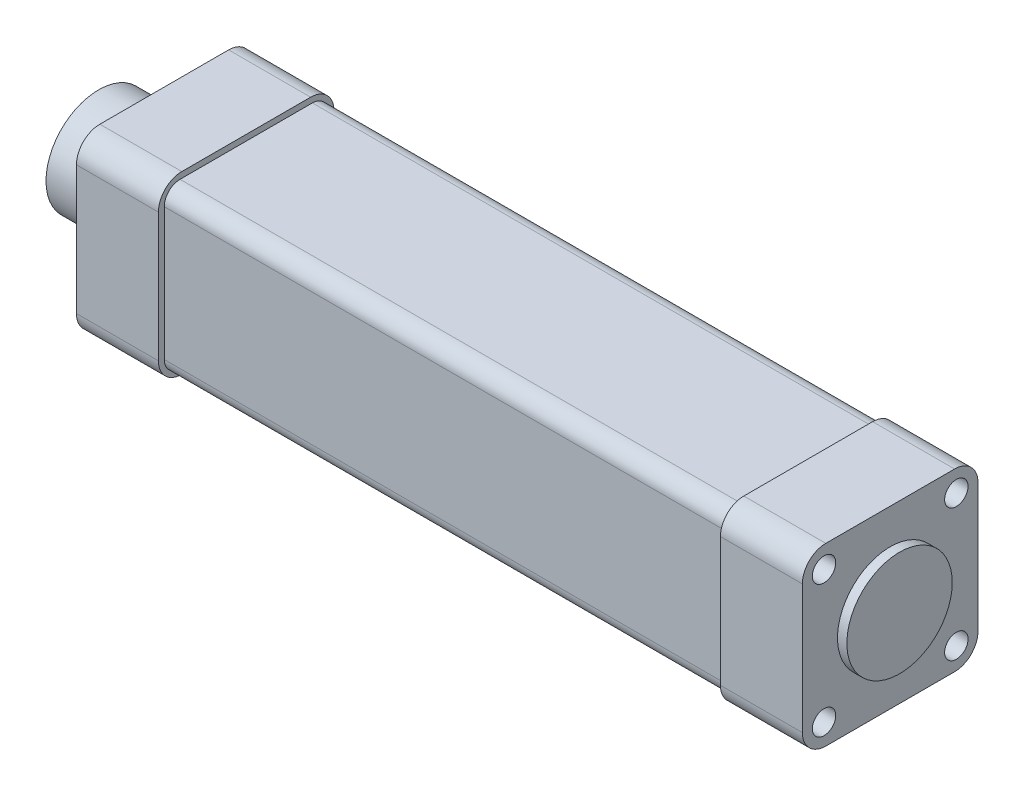
ISO-10303-21;
HEADER;
FILE_DESCRIPTION(('STEP AP214'),'2;1');
FILE_NAME('part.step','',(''),(''),'','','');
FILE_SCHEMA(('AUTOMOTIVE_DESIGN { 1 0 10303 214 1 1 1 1 }'));
ENDSEC;
DATA;
#1=APPLICATION_CONTEXT('core data for automotive mechanical design processes');
#2=APPLICATION_PROTOCOL_DEFINITION('international standard','automotive_design',2000,#1);
#3=PRODUCT_CONTEXT('',#1,'mechanical');
#4=PRODUCT('Part','Part','',(#3));
#5=PRODUCT_RELATED_PRODUCT_CATEGORY('part','',(#4));
#6=PRODUCT_DEFINITION_FORMATION('','',#4);
#7=PRODUCT_DEFINITION_CONTEXT('part definition',#1,'design');
#8=PRODUCT_DEFINITION('design','',#6,#7);
#9=PRODUCT_DEFINITION_SHAPE('','',#8);
#10=(LENGTH_UNIT() NAMED_UNIT(*) SI_UNIT(.MILLI.,.METRE.));
#11=(NAMED_UNIT(*) PLANE_ANGLE_UNIT() SI_UNIT($,.RADIAN.));
#12=(NAMED_UNIT(*) SI_UNIT($,.STERADIAN.) SOLID_ANGLE_UNIT());
#13=UNCERTAINTY_MEASURE_WITH_UNIT(LENGTH_MEASURE(1.E-05),#10,'distance_accuracy_value','');
#14=(GEOMETRIC_REPRESENTATION_CONTEXT(3) GLOBAL_UNCERTAINTY_ASSIGNED_CONTEXT((#13)) GLOBAL_UNIT_ASSIGNED_CONTEXT((#10,
#11,#12)) REPRESENTATION_CONTEXT('',''));
#15=CARTESIAN_POINT('',(0.,0.,0.));
#16=DIRECTION('',(0.,0.,1.));
#17=DIRECTION('',(1.,0.,0.));
#18=AXIS2_PLACEMENT_3D('',#15,#16,#17);
#19=CARTESIAN_POINT('',(0.,27.5,27.5));
#20=DIRECTION('',(-1.,0.,0.));
#21=DIRECTION('',(0.,0.,1.));
#22=AXIS2_PLACEMENT_3D('',#19,#20,#21);
#23=PLANE('',#22);
#24=CARTESIAN_POINT('',(0.,0.,0.));
#25=DIRECTION('',(-1.,0.,0.));
#26=DIRECTION('',(0.,0.,1.));
#27=AXIS2_PLACEMENT_3D('',#24,#25,#26);
#28=CIRCLE('',#27,10.);
#29=CARTESIAN_POINT('',(0.,0.,10.));
#30=VERTEX_POINT('',#29);
#31=EDGE_CURVE('E513',#30,#30,#28,.F.);
#32=ORIENTED_EDGE('',*,*,#31,.F.);
#33=EDGE_LOOP('',(#32));
#34=FACE_BOUND('',#33,.T.);
#35=CARTESIAN_POINT('',(0.,0.,0.));
#36=DIRECTION('',(1.,0.,0.));
#37=DIRECTION('',(0.,0.,-1.));
#38=AXIS2_PLACEMENT_3D('',#35,#36,#37);
#39=CIRCLE('',#38,31.5);
#40=CARTESIAN_POINT('',(0.,0.,-31.5));
#41=VERTEX_POINT('',#40);
#42=EDGE_CURVE('E307',#41,#41,#39,.T.);
#43=ORIENTED_EDGE('',*,*,#42,.T.);
#44=EDGE_LOOP('',(#43));
#45=FACE_BOUND('',#44,.T.);
#46=ADVANCED_FACE('F39',(#34,#45),#23,.F.);
#47=CARTESIAN_POINT('',(240.,-27.5,-27.5));
#48=DIRECTION('',(1.,0.,0.));
#49=DIRECTION('',(0.,0.,-1.));
#50=AXIS2_PLACEMENT_3D('',#47,#48,#49);
#51=PLANE('',#50);
#52=CARTESIAN_POINT('',(240.,0.,0.));
#53=DIRECTION('',(1.,0.,0.));
#54=DIRECTION('',(0.,0.,-1.));
#55=AXIS2_PLACEMENT_3D('',#52,#53,#54);
#56=CIRCLE('',#55,31.5);
#57=CARTESIAN_POINT('',(240.,0.,-31.5));
#58=VERTEX_POINT('',#57);
#59=EDGE_CURVE('E304',#58,#58,#56,.T.);
#60=ORIENTED_EDGE('',*,*,#59,.F.);
#61=EDGE_LOOP('',(#60));
#62=FACE_BOUND('',#61,.T.);
#63=ADVANCED_FACE('F407',(#62),#51,.F.);
#64=CARTESIAN_POINT('',(240.,0.,0.));
#65=DIRECTION('',(-1.,0.,0.));
#66=DIRECTION('',(0.,0.,1.));
#67=AXIS2_PLACEMENT_3D('',#64,#65,#66);
#68=CYLINDRICAL_SURFACE('',#67,31.5);
#69=ORIENTED_EDGE('',*,*,#59,.T.);
#70=EDGE_LOOP('',(#69));
#71=FACE_BOUND('',#70,.T.);
#72=ORIENTED_EDGE('',*,*,#42,.F.);
#73=EDGE_LOOP('',(#72));
#74=FACE_BOUND('',#73,.T.);
#75=ADVANCED_FACE('F413',(#71,#74),#68,.F.);
#76=CARTESIAN_POINT('',(279.001,0.,0.));
#77=DIRECTION('',(-1.,0.,0.));
#78=DIRECTION('',(0.,0.,1.));
#79=AXIS2_PLACEMENT_3D('',#76,#77,#78);
#80=CYLINDRICAL_SURFACE('',#79,10.);
#81=CARTESIAN_POINT('',(-63.,0.,0.));
#82=DIRECTION('',(-1.,0.,0.));
#83=DIRECTION('',(0.,0.,1.));
#84=AXIS2_PLACEMENT_3D('',#81,#82,#83);
#85=CIRCLE('',#84,10.);
#86=CARTESIAN_POINT('',(-63.,0.,10.));
#87=VERTEX_POINT('',#86);
#88=EDGE_CURVE('E510',#87,#87,#85,.T.);
#89=ORIENTED_EDGE('',*,*,#88,.T.);
#90=EDGE_LOOP('',(#89));
#91=FACE_BOUND('',#90,.T.);
#92=ORIENTED_EDGE('',*,*,#31,.T.);
#93=EDGE_LOOP('',(#92));
#94=FACE_BOUND('',#93,.T.);
#95=ADVANCED_FACE('F516',(#91,#94),#80,.F.);
#96=CARTESIAN_POINT('',(-35.,27.5,27.5));
#97=DIRECTION('',(-1.,0.,0.));
#98=DIRECTION('',(0.,0.,1.));
#99=AXIS2_PLACEMENT_3D('',#96,#97,#98);
#100=PLANE('',#99);
#101=CARTESIAN_POINT('',(-35.,-28.25,-28.25));
#102=DIRECTION('',(-1.,0.,0.));
#103=DIRECTION('',(0.,0.,1.));
#104=AXIS2_PLACEMENT_3D('',#101,#102,#103);
#105=CIRCLE('',#104,5.);
#106=CARTESIAN_POINT('',(-35.,-28.25,-23.25));
#107=VERTEX_POINT('',#106);
#108=EDGE_CURVE('E501',#107,#107,#105,.T.);
#109=ORIENTED_EDGE('',*,*,#108,.F.);
#110=EDGE_LOOP('',(#109));
#111=FACE_BOUND('',#110,.T.);
#112=CARTESIAN_POINT('',(-35.,28.25,28.25));
#113=DIRECTION('',(-1.,0.,0.));
#114=DIRECTION('',(0.,0.,1.));
#115=AXIS2_PLACEMENT_3D('',#112,#113,#114);
#116=CIRCLE('',#115,5.);
#117=CARTESIAN_POINT('',(-35.,28.25,33.25));
#118=VERTEX_POINT('',#117);
#119=EDGE_CURVE('E440',#118,#118,#116,.T.);
#120=ORIENTED_EDGE('',*,*,#119,.F.);
#121=EDGE_LOOP('',(#120));
#122=FACE_BOUND('',#121,.T.);
#123=CARTESIAN_POINT('',(-35.,27.5,27.5));
#124=DIRECTION('',(-1.,0.,0.));
#125=DIRECTION('',(0.,0.,1.));
#126=AXIS2_PLACEMENT_3D('',#123,#124,#125);
#127=CIRCLE('',#126,9.99999999999999);
#128=CARTESIAN_POINT('',(-35.,27.5,37.5));
#129=VERTEX_POINT('',#128);
#130=CARTESIAN_POINT('',(-35.,37.5,27.5));
#131=VERTEX_POINT('',#130);
#132=EDGE_CURVE('E208',#129,#131,#127,.T.);
#133=ORIENTED_EDGE('',*,*,#132,.T.);
#134=DIRECTION('',(0.,0.,-1.));
#135=VECTOR('',#134,1.);
#136=CARTESIAN_POINT('',(-35.,37.5,27.5));
#137=LINE('',#136,#135);
#138=CARTESIAN_POINT('',(-35.,37.5,-27.5));
#139=VERTEX_POINT('',#138);
#140=EDGE_CURVE('E197',#131,#139,#137,.T.);
#141=ORIENTED_EDGE('',*,*,#140,.T.);
#142=CARTESIAN_POINT('',(-35.,27.5,-27.5));
#143=DIRECTION('',(-1.,0.,0.));
#144=DIRECTION('',(0.,0.,1.));
#145=AXIS2_PLACEMENT_3D('',#142,#143,#144);
#146=CIRCLE('',#145,9.99999999999999);
#147=CARTESIAN_POINT('',(-35.,27.5,-37.5));
#148=VERTEX_POINT('',#147);
#149=EDGE_CURVE('E207',#139,#148,#146,.T.);
#150=ORIENTED_EDGE('',*,*,#149,.T.);
#151=DIRECTION('',(0.,-1.,0.));
#152=VECTOR('',#151,1.);
#153=CARTESIAN_POINT('',(-35.,-27.5,-37.5));
#154=LINE('',#153,#152);
#155=CARTESIAN_POINT('',(-35.,-27.5,-37.5));
#156=VERTEX_POINT('',#155);
#157=EDGE_CURVE('E475',#148,#156,#154,.T.);
#158=ORIENTED_EDGE('',*,*,#157,.T.);
#159=CARTESIAN_POINT('',(-35.,-27.5,-27.5));
#160=DIRECTION('',(-1.,0.,0.));
#161=DIRECTION('',(0.,0.,-1.));
#162=AXIS2_PLACEMENT_3D('',#159,#160,#161);
#163=CIRCLE('',#162,10.);
#164=CARTESIAN_POINT('',(-35.,-37.5,-27.5));
#165=VERTEX_POINT('',#164);
#166=EDGE_CURVE('E490',#156,#165,#163,.T.);
#167=ORIENTED_EDGE('',*,*,#166,.T.);
#168=DIRECTION('',(0.,0.,1.));
#169=VECTOR('',#168,1.);
#170=CARTESIAN_POINT('',(-35.,-37.5,27.5));
#171=LINE('',#170,#169);
#172=CARTESIAN_POINT('',(-35.,-37.5,27.5));
#173=VERTEX_POINT('',#172);
#174=EDGE_CURVE('E487',#165,#173,#171,.T.);
#175=ORIENTED_EDGE('',*,*,#174,.T.);
#176=CARTESIAN_POINT('',(-35.,-27.5,27.5));
#177=DIRECTION('',(-1.,0.,0.));
#178=DIRECTION('',(0.,0.,1.));
#179=AXIS2_PLACEMENT_3D('',#176,#177,#178);
#180=CIRCLE('',#179,9.99999999999999);
#181=CARTESIAN_POINT('',(-35.,-27.5,37.5));
#182=VERTEX_POINT('',#181);
#183=EDGE_CURVE('E489',#173,#182,#180,.T.);
#184=ORIENTED_EDGE('',*,*,#183,.T.);
#185=DIRECTION('',(0.,1.,0.));
#186=VECTOR('',#185,1.);
#187=CARTESIAN_POINT('',(-35.,-27.5,37.5));
#188=LINE('',#187,#186);
#189=EDGE_CURVE('E214',#182,#129,#188,.T.);
#190=ORIENTED_EDGE('',*,*,#189,.T.);
#191=EDGE_LOOP('',(#133,#141,#150,#158,#167,#175,#184,#190));
#192=FACE_BOUND('',#191,.T.);
#193=CARTESIAN_POINT('',(-35.,28.25,-28.25));
#194=DIRECTION('',(-1.,0.,0.));
#195=DIRECTION('',(0.,0.,1.));
#196=AXIS2_PLACEMENT_3D('',#193,#194,#195);
#197=CIRCLE('',#196,5.);
#198=CARTESIAN_POINT('',(-35.,28.25,-23.25));
#199=VERTEX_POINT('',#198);
#200=EDGE_CURVE('E435',#199,#199,#197,.T.);
#201=ORIENTED_EDGE('',*,*,#200,.F.);
#202=EDGE_LOOP('',(#201));
#203=FACE_BOUND('',#202,.T.);
#204=CARTESIAN_POINT('',(-35.,-28.25,28.25));
#205=DIRECTION('',(-1.,0.,0.));
#206=DIRECTION('',(0.,0.,1.));
#207=AXIS2_PLACEMENT_3D('',#204,#205,#206);
#208=CIRCLE('',#207,5.);
#209=CARTESIAN_POINT('',(-35.,-28.25,33.25));
#210=VERTEX_POINT('',#209);
#211=EDGE_CURVE('E498',#210,#210,#208,.T.);
#212=ORIENTED_EDGE('',*,*,#211,.F.);
#213=EDGE_LOOP('',(#212));
#214=FACE_BOUND('',#213,.T.);
#215=CARTESIAN_POINT('',(-35.,0.,0.));
#216=DIRECTION('',(-1.,0.,0.));
#217=DIRECTION('',(0.,0.,1.));
#218=AXIS2_PLACEMENT_3D('',#215,#216,#217);
#219=CIRCLE('',#218,22.5);
#220=CARTESIAN_POINT('',(-35.,0.,22.5));
#221=VERTEX_POINT('',#220);
#222=EDGE_CURVE('E504',#221,#221,#219,.T.);
#223=ORIENTED_EDGE('',*,*,#222,.F.);
#224=EDGE_LOOP('',(#223));
#225=FACE_BOUND('',#224,.T.);
#226=ADVANCED_FACE('F211',(#111,#122,#192,#203,#214,#225),#100,.T.);
#227=CARTESIAN_POINT('',(275.,-27.5,-27.5));
#228=DIRECTION('',(1.,0.,0.));
#229=DIRECTION('',(0.,0.,-1.));
#230=AXIS2_PLACEMENT_3D('',#227,#228,#229);
#231=PLANE('',#230);
#232=CARTESIAN_POINT('',(275.,-28.25,28.25));
#233=DIRECTION('',(1.,0.,0.));
#234=DIRECTION('',(0.,0.,-1.));
#235=AXIS2_PLACEMENT_3D('',#232,#233,#234);
#236=CIRCLE('',#235,5.);
#237=CARTESIAN_POINT('',(275.,-28.25,23.25));
#238=VERTEX_POINT('',#237);
#239=EDGE_CURVE('E233',#238,#238,#236,.T.);
#240=ORIENTED_EDGE('',*,*,#239,.F.);
#241=EDGE_LOOP('',(#240));
#242=FACE_BOUND('',#241,.T.);
#243=CARTESIAN_POINT('',(275.,28.25,-28.25));
#244=DIRECTION('',(1.,0.,0.));
#245=DIRECTION('',(0.,0.,-1.));
#246=AXIS2_PLACEMENT_3D('',#243,#244,#245);
#247=CIRCLE('',#246,5.);
#248=CARTESIAN_POINT('',(275.,28.25,-33.25));
#249=VERTEX_POINT('',#248);
#250=EDGE_CURVE('E240',#249,#249,#247,.T.);
#251=ORIENTED_EDGE('',*,*,#250,.F.);
#252=EDGE_LOOP('',(#251));
#253=FACE_BOUND('',#252,.T.);
#254=CARTESIAN_POINT('',(275.,-27.5,-27.5));
#255=DIRECTION('',(1.,0.,0.));
#256=DIRECTION('',(0.,0.,-1.));
#257=AXIS2_PLACEMENT_3D('',#254,#255,#256);
#258=CIRCLE('',#257,10.);
#259=CARTESIAN_POINT('',(275.,-37.5,-27.5));
#260=VERTEX_POINT('',#259);
#261=CARTESIAN_POINT('',(275.,-27.5,-37.5));
#262=VERTEX_POINT('',#261);
#263=EDGE_CURVE('E247',#260,#262,#258,.T.);
#264=ORIENTED_EDGE('',*,*,#263,.T.);
#265=DIRECTION('',(0.,1.,0.));
#266=VECTOR('',#265,1.);
#267=CARTESIAN_POINT('',(275.,-27.5,-37.5));
#268=LINE('',#267,#266);
#269=CARTESIAN_POINT('',(275.,27.5,-37.5));
#270=VERTEX_POINT('',#269);
#271=EDGE_CURVE('E250',#262,#270,#268,.T.);
#272=ORIENTED_EDGE('',*,*,#271,.T.);
#273=CARTESIAN_POINT('',(275.,27.5,-27.5));
#274=DIRECTION('',(1.,0.,0.));
#275=DIRECTION('',(0.,0.,1.));
#276=AXIS2_PLACEMENT_3D('',#273,#274,#275);
#277=CIRCLE('',#276,10.);
#278=CARTESIAN_POINT('',(275.,37.5,-27.5));
#279=VERTEX_POINT('',#278);
#280=EDGE_CURVE('E253',#270,#279,#277,.T.);
#281=ORIENTED_EDGE('',*,*,#280,.T.);
#282=DIRECTION('',(0.,0.,1.));
#283=VECTOR('',#282,1.);
#284=CARTESIAN_POINT('',(275.,37.5,27.5));
#285=LINE('',#284,#283);
#286=CARTESIAN_POINT('',(275.,37.5,27.5));
#287=VERTEX_POINT('',#286);
#288=EDGE_CURVE('E255',#279,#287,#285,.T.);
#289=ORIENTED_EDGE('',*,*,#288,.T.);
#290=CARTESIAN_POINT('',(275.,27.5,27.5));
#291=DIRECTION('',(1.,0.,0.));
#292=DIRECTION('',(0.,0.,1.));
#293=AXIS2_PLACEMENT_3D('',#290,#291,#292);
#294=CIRCLE('',#293,10.);
#295=CARTESIAN_POINT('',(275.,27.5,37.5));
#296=VERTEX_POINT('',#295);
#297=EDGE_CURVE('E257',#287,#296,#294,.T.);
#298=ORIENTED_EDGE('',*,*,#297,.T.);
#299=DIRECTION('',(0.,-1.,0.));
#300=VECTOR('',#299,1.);
#301=CARTESIAN_POINT('',(275.,-27.5,37.5));
#302=LINE('',#301,#300);
#303=CARTESIAN_POINT('',(275.,-27.5,37.5));
#304=VERTEX_POINT('',#303);
#305=EDGE_CURVE('E259',#296,#304,#302,.T.);
#306=ORIENTED_EDGE('',*,*,#305,.T.);
#307=CARTESIAN_POINT('',(275.,-27.5,27.5));
#308=DIRECTION('',(1.,0.,0.));
#309=DIRECTION('',(0.,0.,1.));
#310=AXIS2_PLACEMENT_3D('',#307,#308,#309);
#311=CIRCLE('',#310,10.);
#312=CARTESIAN_POINT('',(275.,-37.5,27.5));
#313=VERTEX_POINT('',#312);
#314=EDGE_CURVE('E261',#304,#313,#311,.T.);
#315=ORIENTED_EDGE('',*,*,#314,.T.);
#316=DIRECTION('',(0.,0.,-1.));
#317=VECTOR('',#316,1.);
#318=CARTESIAN_POINT('',(275.,-37.5,27.5));
#319=LINE('',#318,#317);
#320=EDGE_CURVE('E263',#313,#260,#319,.T.);
#321=ORIENTED_EDGE('',*,*,#320,.T.);
#322=EDGE_LOOP('',(#264,#272,#281,#289,#298,#306,#315,#321));
#323=FACE_BOUND('',#322,.T.);
#324=CARTESIAN_POINT('',(275.,28.25,28.25));
#325=DIRECTION('',(1.,0.,0.));
#326=DIRECTION('',(0.,0.,-1.));
#327=AXIS2_PLACEMENT_3D('',#324,#325,#326);
#328=CIRCLE('',#327,5.);
#329=CARTESIAN_POINT('',(275.,28.25,23.25));
#330=VERTEX_POINT('',#329);
#331=EDGE_CURVE('E243',#330,#330,#328,.T.);
#332=ORIENTED_EDGE('',*,*,#331,.F.);
#333=EDGE_LOOP('',(#332));
#334=FACE_BOUND('',#333,.T.);
#335=CARTESIAN_POINT('',(275.,-28.25,-28.25));
#336=DIRECTION('',(1.,0.,0.));
#337=DIRECTION('',(0.,0.,-1.));
#338=AXIS2_PLACEMENT_3D('',#335,#336,#337);
#339=CIRCLE('',#338,5.);
#340=CARTESIAN_POINT('',(275.,-28.25,-33.25));
#341=VERTEX_POINT('',#340);
#342=EDGE_CURVE('E237',#341,#341,#339,.T.);
#343=ORIENTED_EDGE('',*,*,#342,.F.);
#344=EDGE_LOOP('',(#343));
#345=FACE_BOUND('',#344,.T.);
#346=CARTESIAN_POINT('',(275.,0.,0.));
#347=DIRECTION('',(1.,0.,0.));
#348=DIRECTION('',(0.,0.,-1.));
#349=AXIS2_PLACEMENT_3D('',#346,#347,#348);
#350=CIRCLE('',#349,22.5);
#351=CARTESIAN_POINT('',(275.,0.,-22.5));
#352=VERTEX_POINT('',#351);
#353=EDGE_CURVE('E223',#352,#352,#350,.T.);
#354=ORIENTED_EDGE('',*,*,#353,.F.);
#355=EDGE_LOOP('',(#354));
#356=FACE_BOUND('',#355,.T.);
#357=ADVANCED_FACE('F524',(#242,#253,#323,#334,#345,#356),#231,.T.);
#358=CARTESIAN_POINT('',(240.,-28.25,-28.25));
#359=DIRECTION('',(-1.,0.,0.));
#360=DIRECTION('',(0.,0.,1.));
#361=AXIS2_PLACEMENT_3D('',#358,#359,#360);
#362=CYLINDRICAL_SURFACE('',#361,6.75);
#363=CARTESIAN_POINT('',(0.,-28.25,-28.25));
#364=DIRECTION('',(1.,0.,0.));
#365=DIRECTION('',(0.,0.,1.));
#366=AXIS2_PLACEMENT_3D('',#363,#364,#365);
#367=CIRCLE('',#366,6.75);
#368=CARTESIAN_POINT('',(0.,-35.,-28.25));
#369=VERTEX_POINT('',#368);
#370=CARTESIAN_POINT('',(0.,-28.25,-35.));
#371=VERTEX_POINT('',#370);
#372=EDGE_CURVE('E310',#369,#371,#367,.T.);
#373=ORIENTED_EDGE('',*,*,#372,.T.);
#374=DIRECTION('',(-1.,0.,0.));
#375=VECTOR('',#374,1.);
#376=CARTESIAN_POINT('',(240.,-28.25,-35.));
#377=LINE('',#376,#375);
#378=CARTESIAN_POINT('',(240.,-28.25,-35.));
#379=VERTEX_POINT('',#378);
#380=EDGE_CURVE('E11',#379,#371,#377,.T.);
#381=ORIENTED_EDGE('',*,*,#380,.F.);
#382=CARTESIAN_POINT('',(240.,-28.25,-28.25));
#383=DIRECTION('',(1.,0.,0.));
#384=DIRECTION('',(0.,0.,1.));
#385=AXIS2_PLACEMENT_3D('',#382,#383,#384);
#386=CIRCLE('',#385,6.75);
#387=CARTESIAN_POINT('',(240.,-35.,-28.25));
#388=VERTEX_POINT('',#387);
#389=EDGE_CURVE('E311',#388,#379,#386,.T.);
#390=ORIENTED_EDGE('',*,*,#389,.F.);
#391=DIRECTION('',(-1.,0.,0.));
#392=VECTOR('',#391,1.);
#393=CARTESIAN_POINT('',(240.,-35.,-28.25));
#394=LINE('',#393,#392);
#395=EDGE_CURVE('E336',#388,#369,#394,.T.);
#396=ORIENTED_EDGE('',*,*,#395,.T.);
#397=EDGE_LOOP('',(#373,#381,#390,#396));
#398=FACE_BOUND('',#397,.T.);
#399=ADVANCED_FACE('F41',(#398),#362,.T.);
#400=CARTESIAN_POINT('',(240.,28.25,-35.));
#401=DIRECTION('',(0.,0.,1.));
#402=DIRECTION('',(1.,0.,0.));
#403=AXIS2_PLACEMENT_3D('',#400,#401,#402);
#404=PLANE('',#403);
#405=DIRECTION('',(0.,1.,0.));
#406=VECTOR('',#405,1.);
#407=CARTESIAN_POINT('',(0.,28.25,-35.));
#408=LINE('',#407,#406);
#409=CARTESIAN_POINT('',(0.,28.25,-35.));
#410=VERTEX_POINT('',#409);
#411=EDGE_CURVE('E339',#371,#410,#408,.T.);
#412=ORIENTED_EDGE('',*,*,#411,.T.);
#413=DIRECTION('',(-1.,0.,0.));
#414=VECTOR('',#413,1.);
#415=CARTESIAN_POINT('',(240.,28.25,-35.));
#416=LINE('',#415,#414);
#417=CARTESIAN_POINT('',(240.,28.25,-35.));
#418=VERTEX_POINT('',#417);
#419=EDGE_CURVE('E48',#418,#410,#416,.T.);
#420=ORIENTED_EDGE('',*,*,#419,.F.);
#421=DIRECTION('',(0.,1.,0.));
#422=VECTOR('',#421,1.);
#423=CARTESIAN_POINT('',(240.,28.25,-35.));
#424=LINE('',#423,#422);
#425=EDGE_CURVE('E314',#379,#418,#424,.T.);
#426=ORIENTED_EDGE('',*,*,#425,.F.);
#427=ORIENTED_EDGE('',*,*,#380,.T.);
#428=EDGE_LOOP('',(#412,#420,#426,#427));
#429=FACE_BOUND('',#428,.T.);
#430=ADVANCED_FACE('F377',(#429),#404,.F.);
#431=CARTESIAN_POINT('',(240.,28.25,-28.25));
#432=DIRECTION('',(-1.,0.,0.));
#433=DIRECTION('',(0.,0.,1.));
#434=AXIS2_PLACEMENT_3D('',#431,#432,#433);
#435=CYLINDRICAL_SURFACE('',#434,6.75);
#436=CARTESIAN_POINT('',(0.,28.25,-28.25));
#437=DIRECTION('',(1.,0.,0.));
#438=DIRECTION('',(0.,0.,-1.));
#439=AXIS2_PLACEMENT_3D('',#436,#437,#438);
#440=CIRCLE('',#439,6.75);
#441=CARTESIAN_POINT('',(0.,35.,-28.25));
#442=VERTEX_POINT('',#441);
#443=EDGE_CURVE('E342',#410,#442,#440,.T.);
#444=ORIENTED_EDGE('',*,*,#443,.T.);
#445=DIRECTION('',(-1.,0.,0.));
#446=VECTOR('',#445,1.);
#447=CARTESIAN_POINT('',(240.,35.,-28.25));
#448=LINE('',#447,#446);
#449=CARTESIAN_POINT('',(240.,35.,-28.25));
#450=VERTEX_POINT('',#449);
#451=EDGE_CURVE('E370',#450,#442,#448,.T.);
#452=ORIENTED_EDGE('',*,*,#451,.F.);
#453=CARTESIAN_POINT('',(240.,28.25,-28.25));
#454=DIRECTION('',(1.,0.,0.));
#455=DIRECTION('',(0.,0.,-1.));
#456=AXIS2_PLACEMENT_3D('',#453,#454,#455);
#457=CIRCLE('',#456,6.75);
#458=EDGE_CURVE('E318',#418,#450,#457,.T.);
#459=ORIENTED_EDGE('',*,*,#458,.F.);
#460=ORIENTED_EDGE('',*,*,#419,.T.);
#461=EDGE_LOOP('',(#444,#452,#459,#460));
#462=FACE_BOUND('',#461,.T.);
#463=ADVANCED_FACE('F375',(#462),#435,.T.);
#464=CARTESIAN_POINT('',(240.,35.,-28.25));
#465=DIRECTION('',(0.,-1.,0.));
#466=DIRECTION('',(0.,0.,-1.));
#467=AXIS2_PLACEMENT_3D('',#464,#465,#466);
#468=PLANE('',#467);
#469=DIRECTION('',(0.,0.,1.));
#470=VECTOR('',#469,1.);
#471=CARTESIAN_POINT('',(0.,35.,-28.25));
#472=LINE('',#471,#470);
#473=CARTESIAN_POINT('',(0.,35.,28.25));
#474=VERTEX_POINT('',#473);
#475=EDGE_CURVE('E345',#442,#474,#472,.T.);
#476=ORIENTED_EDGE('',*,*,#475,.T.);
#477=DIRECTION('',(-1.,0.,0.));
#478=VECTOR('',#477,1.);
#479=CARTESIAN_POINT('',(240.,35.,28.25));
#480=LINE('',#479,#478);
#481=CARTESIAN_POINT('',(240.,35.,28.25));
#482=VERTEX_POINT('',#481);
#483=EDGE_CURVE('E367',#482,#474,#480,.T.);
#484=ORIENTED_EDGE('',*,*,#483,.F.);
#485=DIRECTION('',(0.,0.,1.));
#486=VECTOR('',#485,1.);
#487=CARTESIAN_POINT('',(240.,35.,-28.25));
#488=LINE('',#487,#486);
#489=EDGE_CURVE('E321',#450,#482,#488,.T.);
#490=ORIENTED_EDGE('',*,*,#489,.F.);
#491=ORIENTED_EDGE('',*,*,#451,.T.);
#492=EDGE_LOOP('',(#476,#484,#490,#491));
#493=FACE_BOUND('',#492,.T.);
#494=ADVANCED_FACE('F383',(#493),#468,.F.);
#495=CARTESIAN_POINT('',(240.,28.25,28.25));
#496=DIRECTION('',(-1.,0.,0.));
#497=DIRECTION('',(0.,0.,1.));
#498=AXIS2_PLACEMENT_3D('',#495,#496,#497);
#499=CYLINDRICAL_SURFACE('',#498,6.75);
#500=CARTESIAN_POINT('',(0.,28.25,28.25));
#501=DIRECTION('',(1.,0.,0.));
#502=DIRECTION('',(0.,0.,1.));
#503=AXIS2_PLACEMENT_3D('',#500,#501,#502);
#504=CIRCLE('',#503,6.75);
#505=CARTESIAN_POINT('',(0.,28.25,35.));
#506=VERTEX_POINT('',#505);
#507=EDGE_CURVE('E348',#474,#506,#504,.T.);
#508=ORIENTED_EDGE('',*,*,#507,.T.);
#509=DIRECTION('',(-1.,0.,0.));
#510=VECTOR('',#509,1.);
#511=CARTESIAN_POINT('',(240.,28.25,35.));
#512=LINE('',#511,#510);
#513=CARTESIAN_POINT('',(240.,28.25,35.));
#514=VERTEX_POINT('',#513);
#515=EDGE_CURVE('E364',#514,#506,#512,.T.);
#516=ORIENTED_EDGE('',*,*,#515,.F.);
#517=CARTESIAN_POINT('',(240.,28.25,28.25));
#518=DIRECTION('',(1.,0.,0.));
#519=DIRECTION('',(0.,0.,1.));
#520=AXIS2_PLACEMENT_3D('',#517,#518,#519);
#521=CIRCLE('',#520,6.75);
#522=EDGE_CURVE('E324',#482,#514,#521,.T.);
#523=ORIENTED_EDGE('',*,*,#522,.F.);
#524=ORIENTED_EDGE('',*,*,#483,.T.);
#525=EDGE_LOOP('',(#508,#516,#523,#524));
#526=FACE_BOUND('',#525,.T.);
#527=ADVANCED_FACE('F387',(#526),#499,.T.);
#528=CARTESIAN_POINT('',(240.,28.25,35.));
#529=DIRECTION('',(0.,0.,-1.));
#530=DIRECTION('',(0.,1.,0.));
#531=AXIS2_PLACEMENT_3D('',#528,#529,#530);
#532=PLANE('',#531);
#533=DIRECTION('',(0.,-1.,0.));
#534=VECTOR('',#533,1.);
#535=CARTESIAN_POINT('',(0.,28.25,35.));
#536=LINE('',#535,#534);
#537=CARTESIAN_POINT('',(0.,-28.25,35.));
#538=VERTEX_POINT('',#537);
#539=EDGE_CURVE('E351',#506,#538,#536,.T.);
#540=ORIENTED_EDGE('',*,*,#539,.T.);
#541=DIRECTION('',(-1.,0.,0.));
#542=VECTOR('',#541,1.);
#543=CARTESIAN_POINT('',(240.,-28.25,35.));
#544=LINE('',#543,#542);
#545=CARTESIAN_POINT('',(240.,-28.25,35.));
#546=VERTEX_POINT('',#545);
#547=EDGE_CURVE('E361',#546,#538,#544,.T.);
#548=ORIENTED_EDGE('',*,*,#547,.F.);
#549=DIRECTION('',(0.,-1.,0.));
#550=VECTOR('',#549,1.);
#551=CARTESIAN_POINT('',(240.,28.25,35.));
#552=LINE('',#551,#550);
#553=EDGE_CURVE('E327',#514,#546,#552,.T.);
#554=ORIENTED_EDGE('',*,*,#553,.F.);
#555=ORIENTED_EDGE('',*,*,#515,.T.);
#556=EDGE_LOOP('',(#540,#548,#554,#555));
#557=FACE_BOUND('',#556,.T.);
#558=ADVANCED_FACE('F397',(#557),#532,.F.);
#559=CARTESIAN_POINT('',(240.,-28.25,28.25));
#560=DIRECTION('',(-1.,0.,0.));
#561=DIRECTION('',(0.,0.,1.));
#562=AXIS2_PLACEMENT_3D('',#559,#560,#561);
#563=CYLINDRICAL_SURFACE('',#562,6.75);
#564=CARTESIAN_POINT('',(0.,-28.25,28.25));
#565=DIRECTION('',(1.,0.,0.));
#566=DIRECTION('',(0.,0.,-1.));
#567=AXIS2_PLACEMENT_3D('',#564,#565,#566);
#568=CIRCLE('',#567,6.75);
#569=CARTESIAN_POINT('',(0.,-35.,28.25));
#570=VERTEX_POINT('',#569);
#571=EDGE_CURVE('E354',#538,#570,#568,.T.);
#572=ORIENTED_EDGE('',*,*,#571,.T.);
#573=DIRECTION('',(-1.,0.,0.));
#574=VECTOR('',#573,1.);
#575=CARTESIAN_POINT('',(240.,-35.,28.25));
#576=LINE('',#575,#574);
#577=CARTESIAN_POINT('',(240.,-35.,28.25));
#578=VERTEX_POINT('',#577);
#579=EDGE_CURVE('E55',#578,#570,#576,.T.);
#580=ORIENTED_EDGE('',*,*,#579,.F.);
#581=CARTESIAN_POINT('',(240.,-28.25,28.25));
#582=DIRECTION('',(1.,0.,0.));
#583=DIRECTION('',(0.,0.,-1.));
#584=AXIS2_PLACEMENT_3D('',#581,#582,#583);
#585=CIRCLE('',#584,6.75);
#586=EDGE_CURVE('E330',#546,#578,#585,.T.);
#587=ORIENTED_EDGE('',*,*,#586,.F.);
#588=ORIENTED_EDGE('',*,*,#547,.T.);
#589=EDGE_LOOP('',(#572,#580,#587,#588));
#590=FACE_BOUND('',#589,.T.);
#591=ADVANCED_FACE('F395',(#590),#563,.T.);
#592=CARTESIAN_POINT('',(240.,-35.,28.25));
#593=DIRECTION('',(0.,1.,0.));
#594=DIRECTION('',(0.,0.,1.));
#595=AXIS2_PLACEMENT_3D('',#592,#593,#594);
#596=PLANE('',#595);
#597=DIRECTION('',(0.,0.,-1.));
#598=VECTOR('',#597,1.);
#599=CARTESIAN_POINT('',(0.,-35.,28.25));
#600=LINE('',#599,#598);
#601=EDGE_CURVE('E315',#570,#369,#600,.T.);
#602=ORIENTED_EDGE('',*,*,#601,.T.);
#603=ORIENTED_EDGE('',*,*,#395,.F.);
#604=DIRECTION('',(0.,0.,-1.));
#605=VECTOR('',#604,1.);
#606=CARTESIAN_POINT('',(240.,-35.,28.25));
#607=LINE('',#606,#605);
#608=EDGE_CURVE('E333',#578,#388,#607,.T.);
#609=ORIENTED_EDGE('',*,*,#608,.F.);
#610=ORIENTED_EDGE('',*,*,#579,.T.);
#611=EDGE_LOOP('',(#602,#603,#609,#610));
#612=FACE_BOUND('',#611,.T.);
#613=ADVANCED_FACE('F394',(#612),#596,.F.);
#614=CARTESIAN_POINT('',(240.,28.25,-28.25));
#615=DIRECTION('',(-1.,0.,0.));
#616=DIRECTION('',(0.,0.,1.));
#617=AXIS2_PLACEMENT_3D('',#614,#615,#616);
#618=CYLINDRICAL_SURFACE('',#617,5.);
#619=ORIENTED_EDGE('',*,*,#250,.T.);
#620=EDGE_LOOP('',(#619));
#621=FACE_BOUND('',#620,.T.);
#622=ORIENTED_EDGE('',*,*,#200,.T.);
#623=EDGE_LOOP('',(#622));
#624=FACE_BOUND('',#623,.T.);
#625=ADVANCED_FACE('F662',(#621,#624),#618,.F.);
#626=CARTESIAN_POINT('',(240.,-28.25,-28.25));
#627=DIRECTION('',(-1.,0.,0.));
#628=DIRECTION('',(0.,0.,1.));
#629=AXIS2_PLACEMENT_3D('',#626,#627,#628);
#630=CYLINDRICAL_SURFACE('',#629,5.);
#631=ORIENTED_EDGE('',*,*,#342,.T.);
#632=EDGE_LOOP('',(#631));
#633=FACE_BOUND('',#632,.T.);
#634=ORIENTED_EDGE('',*,*,#108,.T.);
#635=EDGE_LOOP('',(#634));
#636=FACE_BOUND('',#635,.T.);
#637=ADVANCED_FACE('F649',(#633,#636),#630,.F.);
#638=CARTESIAN_POINT('',(240.,-28.25,28.25));
#639=DIRECTION('',(-1.,0.,0.));
#640=DIRECTION('',(0.,0.,1.));
#641=AXIS2_PLACEMENT_3D('',#638,#639,#640);
#642=CYLINDRICAL_SURFACE('',#641,5.);
#643=ORIENTED_EDGE('',*,*,#239,.T.);
#644=EDGE_LOOP('',(#643));
#645=FACE_BOUND('',#644,.T.);
#646=ORIENTED_EDGE('',*,*,#211,.T.);
#647=EDGE_LOOP('',(#646));
#648=FACE_BOUND('',#647,.T.);
#649=ADVANCED_FACE('F635',(#645,#648),#642,.F.);
#650=CARTESIAN_POINT('',(240.,28.25,28.25));
#651=DIRECTION('',(-1.,0.,0.));
#652=DIRECTION('',(0.,0.,1.));
#653=AXIS2_PLACEMENT_3D('',#650,#651,#652);
#654=CYLINDRICAL_SURFACE('',#653,5.);
#655=ORIENTED_EDGE('',*,*,#331,.T.);
#656=EDGE_LOOP('',(#655));
#657=FACE_BOUND('',#656,.T.);
#658=ORIENTED_EDGE('',*,*,#119,.T.);
#659=EDGE_LOOP('',(#658));
#660=FACE_BOUND('',#659,.T.);
#661=ADVANCED_FACE('F628',(#657,#660),#654,.F.);
#662=CARTESIAN_POINT('',(275.,-37.5,27.5));
#663=DIRECTION('',(0.,1.,0.));
#664=DIRECTION('',(0.,0.,1.));
#665=AXIS2_PLACEMENT_3D('',#662,#663,#664);
#666=PLANE('',#665);
#667=DIRECTION('',(0.,0.,-1.));
#668=VECTOR('',#667,1.);
#669=CARTESIAN_POINT('',(240.,-37.5,27.5));
#670=LINE('',#669,#668);
#671=CARTESIAN_POINT('',(240.,-37.5,27.5));
#672=VERTEX_POINT('',#671);
#673=CARTESIAN_POINT('',(240.,-37.5,-27.5));
#674=VERTEX_POINT('',#673);
#675=EDGE_CURVE('E251',#672,#674,#670,.T.);
#676=ORIENTED_EDGE('',*,*,#675,.T.);
#677=DIRECTION('',(-1.,0.,0.));
#678=VECTOR('',#677,1.);
#679=CARTESIAN_POINT('',(275.,-37.5,-27.5));
#680=LINE('',#679,#678);
#681=EDGE_CURVE('E265',#260,#674,#680,.T.);
#682=ORIENTED_EDGE('',*,*,#681,.F.);
#683=ORIENTED_EDGE('',*,*,#320,.F.);
#684=DIRECTION('',(-1.,0.,0.));
#685=VECTOR('',#684,1.);
#686=CARTESIAN_POINT('',(275.,-37.5,27.5));
#687=LINE('',#686,#685);
#688=EDGE_CURVE('E283',#313,#672,#687,.T.);
#689=ORIENTED_EDGE('',*,*,#688,.T.);
#690=EDGE_LOOP('',(#676,#682,#683,#689));
#691=FACE_BOUND('',#690,.T.);
#692=ADVANCED_FACE('F634',(#691),#666,.F.);
#693=CARTESIAN_POINT('',(275.,-27.5,27.5));
#694=DIRECTION('',(-1.,0.,0.));
#695=DIRECTION('',(0.,0.,1.));
#696=AXIS2_PLACEMENT_3D('',#693,#694,#695);
#697=CYLINDRICAL_SURFACE('',#696,10.);
#698=CARTESIAN_POINT('',(240.,-27.5,27.5));
#699=DIRECTION('',(1.,0.,0.));
#700=DIRECTION('',(0.,0.,1.));
#701=AXIS2_PLACEMENT_3D('',#698,#699,#700);
#702=CIRCLE('',#701,10.);
#703=CARTESIAN_POINT('',(240.,-27.5,37.5));
#704=VERTEX_POINT('',#703);
#705=EDGE_CURVE('E278',#704,#672,#702,.T.);
#706=ORIENTED_EDGE('',*,*,#705,.T.);
#707=ORIENTED_EDGE('',*,*,#688,.F.);
#708=ORIENTED_EDGE('',*,*,#314,.F.);
#709=DIRECTION('',(-1.,0.,0.));
#710=VECTOR('',#709,1.);
#711=CARTESIAN_POINT('',(275.,-27.5,37.5));
#712=LINE('',#711,#710);
#713=EDGE_CURVE('E286',#304,#704,#712,.T.);
#714=ORIENTED_EDGE('',*,*,#713,.T.);
#715=EDGE_LOOP('',(#706,#707,#708,#714));
#716=FACE_BOUND('',#715,.T.);
#717=ADVANCED_FACE('F771',(#716),#697,.T.);
#718=CARTESIAN_POINT('',(275.,-27.5,37.5));
#719=DIRECTION('',(0.,0.,-1.));
#720=DIRECTION('',(-1.,0.,0.));
#721=AXIS2_PLACEMENT_3D('',#718,#719,#720);
#722=PLANE('',#721);
#723=DIRECTION('',(0.,-1.,0.));
#724=VECTOR('',#723,1.);
#725=CARTESIAN_POINT('',(240.,-27.5,37.5));
#726=LINE('',#725,#724);
#727=CARTESIAN_POINT('',(240.,27.5,37.5));
#728=VERTEX_POINT('',#727);
#729=EDGE_CURVE('E276',#728,#704,#726,.T.);
#730=ORIENTED_EDGE('',*,*,#729,.T.);
#731=ORIENTED_EDGE('',*,*,#713,.F.);
#732=ORIENTED_EDGE('',*,*,#305,.F.);
#733=DIRECTION('',(-1.,0.,0.));
#734=VECTOR('',#733,1.);
#735=CARTESIAN_POINT('',(275.,27.5,37.5));
#736=LINE('',#735,#734);
#737=EDGE_CURVE('E289',#296,#728,#736,.T.);
#738=ORIENTED_EDGE('',*,*,#737,.T.);
#739=EDGE_LOOP('',(#730,#731,#732,#738));
#740=FACE_BOUND('',#739,.T.);
#741=ADVANCED_FACE('F762',(#740),#722,.F.);
#742=CARTESIAN_POINT('',(275.,27.5,27.5));
#743=DIRECTION('',(-1.,0.,0.));
#744=DIRECTION('',(0.,0.,1.));
#745=AXIS2_PLACEMENT_3D('',#742,#743,#744);
#746=CYLINDRICAL_SURFACE('',#745,10.);
#747=CARTESIAN_POINT('',(240.,27.5,27.5));
#748=DIRECTION('',(1.,0.,0.));
#749=DIRECTION('',(0.,0.,1.));
#750=AXIS2_PLACEMENT_3D('',#747,#748,#749);
#751=CIRCLE('',#750,10.);
#752=CARTESIAN_POINT('',(240.,37.5,27.5));
#753=VERTEX_POINT('',#752);
#754=EDGE_CURVE('E274',#753,#728,#751,.T.);
#755=ORIENTED_EDGE('',*,*,#754,.T.);
#756=ORIENTED_EDGE('',*,*,#737,.F.);
#757=ORIENTED_EDGE('',*,*,#297,.F.);
#758=DIRECTION('',(-1.,0.,0.));
#759=VECTOR('',#758,1.);
#760=CARTESIAN_POINT('',(275.,37.5,27.5));
#761=LINE('',#760,#759);
#762=EDGE_CURVE('E292',#287,#753,#761,.T.);
#763=ORIENTED_EDGE('',*,*,#762,.T.);
#764=EDGE_LOOP('',(#755,#756,#757,#763));
#765=FACE_BOUND('',#764,.T.);
#766=ADVANCED_FACE('F753',(#765),#746,.T.);
#767=CARTESIAN_POINT('',(275.,37.5,27.5));
#768=DIRECTION('',(0.,-1.,0.));
#769=DIRECTION('',(0.,0.,-1.));
#770=AXIS2_PLACEMENT_3D('',#767,#768,#769);
#771=PLANE('',#770);
#772=DIRECTION('',(0.,0.,1.));
#773=VECTOR('',#772,1.);
#774=CARTESIAN_POINT('',(240.,37.5,27.5));
#775=LINE('',#774,#773);
#776=CARTESIAN_POINT('',(240.,37.5,-27.5));
#777=VERTEX_POINT('',#776);
#778=EDGE_CURVE('E272',#777,#753,#775,.T.);
#779=ORIENTED_EDGE('',*,*,#778,.T.);
#780=ORIENTED_EDGE('',*,*,#762,.F.);
#781=ORIENTED_EDGE('',*,*,#288,.F.);
#782=DIRECTION('',(-1.,0.,0.));
#783=VECTOR('',#782,1.);
#784=CARTESIAN_POINT('',(275.,37.5,-27.5));
#785=LINE('',#784,#783);
#786=EDGE_CURVE('E295',#279,#777,#785,.T.);
#787=ORIENTED_EDGE('',*,*,#786,.T.);
#788=EDGE_LOOP('',(#779,#780,#781,#787));
#789=FACE_BOUND('',#788,.T.);
#790=ADVANCED_FACE('F744',(#789),#771,.F.);
#791=CARTESIAN_POINT('',(275.,27.5,-27.5));
#792=DIRECTION('',(-1.,0.,0.));
#793=DIRECTION('',(0.,0.,1.));
#794=AXIS2_PLACEMENT_3D('',#791,#792,#793);
#795=CYLINDRICAL_SURFACE('',#794,10.);
#796=CARTESIAN_POINT('',(240.,27.5,-27.5));
#797=DIRECTION('',(1.,0.,0.));
#798=DIRECTION('',(0.,0.,1.));
#799=AXIS2_PLACEMENT_3D('',#796,#797,#798);
#800=CIRCLE('',#799,10.);
#801=CARTESIAN_POINT('',(240.,27.5,-37.5));
#802=VERTEX_POINT('',#801);
#803=EDGE_CURVE('E270',#802,#777,#800,.T.);
#804=ORIENTED_EDGE('',*,*,#803,.T.);
#805=ORIENTED_EDGE('',*,*,#786,.F.);
#806=ORIENTED_EDGE('',*,*,#280,.F.);
#807=DIRECTION('',(-1.,0.,0.));
#808=VECTOR('',#807,1.);
#809=CARTESIAN_POINT('',(275.,27.5,-37.5));
#810=LINE('',#809,#808);
#811=EDGE_CURVE('E298',#270,#802,#810,.T.);
#812=ORIENTED_EDGE('',*,*,#811,.T.);
#813=EDGE_LOOP('',(#804,#805,#806,#812));
#814=FACE_BOUND('',#813,.T.);
#815=ADVANCED_FACE('F735',(#814),#795,.T.);
#816=CARTESIAN_POINT('',(275.,-27.5,-37.5));
#817=DIRECTION('',(0.,0.,1.));
#818=DIRECTION('',(0.,-1.,0.));
#819=AXIS2_PLACEMENT_3D('',#816,#817,#818);
#820=PLANE('',#819);
#821=DIRECTION('',(0.,1.,0.));
#822=VECTOR('',#821,1.);
#823=CARTESIAN_POINT('',(240.,-27.5,-37.5));
#824=LINE('',#823,#822);
#825=CARTESIAN_POINT('',(240.,-27.5,-37.5));
#826=VERTEX_POINT('',#825);
#827=EDGE_CURVE('E268',#826,#802,#824,.T.);
#828=ORIENTED_EDGE('',*,*,#827,.T.);
#829=ORIENTED_EDGE('',*,*,#811,.F.);
#830=ORIENTED_EDGE('',*,*,#271,.F.);
#831=DIRECTION('',(-1.,0.,0.));
#832=VECTOR('',#831,1.);
#833=CARTESIAN_POINT('',(275.,-27.5,-37.5));
#834=LINE('',#833,#832);
#835=EDGE_CURVE('E301',#262,#826,#834,.T.);
#836=ORIENTED_EDGE('',*,*,#835,.T.);
#837=EDGE_LOOP('',(#828,#829,#830,#836));
#838=FACE_BOUND('',#837,.T.);
#839=ADVANCED_FACE('F726',(#838),#820,.F.);
#840=CARTESIAN_POINT('',(275.,-27.5,-27.5));
#841=DIRECTION('',(-1.,0.,0.));
#842=DIRECTION('',(0.,0.,1.));
#843=AXIS2_PLACEMENT_3D('',#840,#841,#842);
#844=CYLINDRICAL_SURFACE('',#843,10.);
#845=CARTESIAN_POINT('',(240.,-27.5,-27.5));
#846=DIRECTION('',(1.,0.,0.));
#847=DIRECTION('',(0.,0.,-1.));
#848=AXIS2_PLACEMENT_3D('',#845,#846,#847);
#849=CIRCLE('',#848,10.);
#850=EDGE_CURVE('E246',#674,#826,#849,.T.);
#851=ORIENTED_EDGE('',*,*,#850,.T.);
#852=ORIENTED_EDGE('',*,*,#835,.F.);
#853=ORIENTED_EDGE('',*,*,#263,.F.);
#854=ORIENTED_EDGE('',*,*,#681,.T.);
#855=EDGE_LOOP('',(#851,#852,#853,#854));
#856=FACE_BOUND('',#855,.T.);
#857=ADVANCED_FACE('F718',(#856),#844,.T.);
#858=ORIENTED_EDGE('',*,*,#850,.F.);
#859=ORIENTED_EDGE('',*,*,#675,.F.);
#860=ORIENTED_EDGE('',*,*,#705,.F.);
#861=ORIENTED_EDGE('',*,*,#729,.F.);
#862=ORIENTED_EDGE('',*,*,#754,.F.);
#863=ORIENTED_EDGE('',*,*,#778,.F.);
#864=ORIENTED_EDGE('',*,*,#803,.F.);
#865=ORIENTED_EDGE('',*,*,#827,.F.);
#866=EDGE_LOOP('',(#858,#859,#860,#861,#862,#863,#864,#865));
#867=FACE_BOUND('',#866,.T.);
#868=ORIENTED_EDGE('',*,*,#608,.T.);
#869=ORIENTED_EDGE('',*,*,#389,.T.);
#870=ORIENTED_EDGE('',*,*,#425,.T.);
#871=ORIENTED_EDGE('',*,*,#458,.T.);
#872=ORIENTED_EDGE('',*,*,#489,.T.);
#873=ORIENTED_EDGE('',*,*,#522,.T.);
#874=ORIENTED_EDGE('',*,*,#553,.T.);
#875=ORIENTED_EDGE('',*,*,#586,.T.);
#876=EDGE_LOOP('',(#868,#869,#870,#871,#872,#873,#874,#875));
#877=FACE_BOUND('',#876,.T.);
#878=ADVANCED_FACE('F390',(#867,#877),#51,.F.);
#879=CARTESIAN_POINT('',(279.,0.,0.));
#880=DIRECTION('',(-1.,0.,0.));
#881=DIRECTION('',(0.,0.,1.));
#882=AXIS2_PLACEMENT_3D('',#879,#880,#881);
#883=CYLINDRICAL_SURFACE('',#882,22.5);
#884=CARTESIAN_POINT('',(279.,0.,0.));
#885=DIRECTION('',(1.,0.,0.));
#886=DIRECTION('',(0.,0.,-1.));
#887=AXIS2_PLACEMENT_3D('',#884,#885,#886);
#888=CIRCLE('',#887,22.5);
#889=CARTESIAN_POINT('',(279.,0.,-22.5));
#890=VERTEX_POINT('',#889);
#891=EDGE_CURVE('E226',#890,#890,#888,.T.);
#892=ORIENTED_EDGE('',*,*,#891,.F.);
#893=EDGE_LOOP('',(#892));
#894=FACE_BOUND('',#893,.T.);
#895=ORIENTED_EDGE('',*,*,#353,.T.);
#896=EDGE_LOOP('',(#895));
#897=FACE_BOUND('',#896,.T.);
#898=ADVANCED_FACE('F687',(#894,#897),#883,.T.);
#899=CARTESIAN_POINT('',(279.,0.,0.));
#900=DIRECTION('',(1.,0.,0.));
#901=DIRECTION('',(0.,0.,-1.));
#902=AXIS2_PLACEMENT_3D('',#899,#900,#901);
#903=PLANE('',#902);
#904=ORIENTED_EDGE('',*,*,#891,.T.);
#905=EDGE_LOOP('',(#904));
#906=FACE_BOUND('',#905,.T.);
#907=ADVANCED_FACE('F624',(#906),#903,.T.);
#908=CARTESIAN_POINT('',(-35.,-27.5,37.5));
#909=DIRECTION('',(0.,0.,-1.));
#910=DIRECTION('',(-1.,0.,0.));
#911=AXIS2_PLACEMENT_3D('',#908,#909,#910);
#912=PLANE('',#911);
#913=DIRECTION('',(0.,1.,0.));
#914=VECTOR('',#913,1.);
#915=CARTESIAN_POINT('',(0.,-27.5,37.5));
#916=LINE('',#915,#914);
#917=CARTESIAN_POINT('',(0.,-27.5,37.5));
#918=VERTEX_POINT('',#917);
#919=CARTESIAN_POINT('',(0.,27.5,37.5));
#920=VERTEX_POINT('',#919);
#921=EDGE_CURVE('E218',#918,#920,#916,.T.);
#922=ORIENTED_EDGE('',*,*,#921,.T.);
#923=DIRECTION('',(1.,0.,0.));
#924=VECTOR('',#923,1.);
#925=CARTESIAN_POINT('',(-35.,27.5,37.5));
#926=LINE('',#925,#924);
#927=EDGE_CURVE('E455',#129,#920,#926,.T.);
#928=ORIENTED_EDGE('',*,*,#927,.F.);
#929=ORIENTED_EDGE('',*,*,#189,.F.);
#930=DIRECTION('',(1.,0.,0.));
#931=VECTOR('',#930,1.);
#932=CARTESIAN_POINT('',(-35.,-27.5,37.5));
#933=LINE('',#932,#931);
#934=EDGE_CURVE('E457',#182,#918,#933,.T.);
#935=ORIENTED_EDGE('',*,*,#934,.T.);
#936=EDGE_LOOP('',(#922,#928,#929,#935));
#937=FACE_BOUND('',#936,.T.);
#938=ADVANCED_FACE('F615',(#937),#912,.F.);
#939=CARTESIAN_POINT('',(-35.,-27.5,27.5));
#940=DIRECTION('',(1.,0.,0.));
#941=DIRECTION('',(0.,0.,-1.));
#942=AXIS2_PLACEMENT_3D('',#939,#940,#941);
#943=CYLINDRICAL_SURFACE('',#942,9.99999999999999);
#944=CARTESIAN_POINT('',(0.,-27.5,27.5));
#945=DIRECTION('',(-1.,0.,0.));
#946=DIRECTION('',(0.,0.,1.));
#947=AXIS2_PLACEMENT_3D('',#944,#945,#946);
#948=CIRCLE('',#947,9.99999999999999);
#949=CARTESIAN_POINT('',(0.,-37.5,27.5));
#950=VERTEX_POINT('',#949);
#951=EDGE_CURVE('E452',#950,#918,#948,.T.);
#952=ORIENTED_EDGE('',*,*,#951,.T.);
#953=ORIENTED_EDGE('',*,*,#934,.F.);
#954=ORIENTED_EDGE('',*,*,#183,.F.);
#955=DIRECTION('',(1.,0.,0.));
#956=VECTOR('',#955,1.);
#957=CARTESIAN_POINT('',(-35.,-37.5,27.5));
#958=LINE('',#957,#956);
#959=EDGE_CURVE('E460',#173,#950,#958,.T.);
#960=ORIENTED_EDGE('',*,*,#959,.T.);
#961=EDGE_LOOP('',(#952,#953,#954,#960));
#962=FACE_BOUND('',#961,.T.);
#963=ADVANCED_FACE('F607',(#962),#943,.T.);
#964=CARTESIAN_POINT('',(-35.,-37.5,27.5));
#965=DIRECTION('',(0.,1.,0.));
#966=DIRECTION('',(0.,0.,1.));
#967=AXIS2_PLACEMENT_3D('',#964,#965,#966);
#968=PLANE('',#967);
#969=DIRECTION('',(0.,0.,1.));
#970=VECTOR('',#969,1.);
#971=CARTESIAN_POINT('',(0.,-37.5,27.5));
#972=LINE('',#971,#970);
#973=CARTESIAN_POINT('',(0.,-37.5,-27.5));
#974=VERTEX_POINT('',#973);
#975=EDGE_CURVE('E450',#974,#950,#972,.T.);
#976=ORIENTED_EDGE('',*,*,#975,.T.);
#977=ORIENTED_EDGE('',*,*,#959,.F.);
#978=ORIENTED_EDGE('',*,*,#174,.F.);
#979=DIRECTION('',(1.,0.,0.));
#980=VECTOR('',#979,1.);
#981=CARTESIAN_POINT('',(-35.,-37.5,-27.5));
#982=LINE('',#981,#980);
#983=EDGE_CURVE('E463',#165,#974,#982,.T.);
#984=ORIENTED_EDGE('',*,*,#983,.T.);
#985=EDGE_LOOP('',(#976,#977,#978,#984));
#986=FACE_BOUND('',#985,.T.);
#987=ADVANCED_FACE('F485',(#986),#968,.F.);
#988=CARTESIAN_POINT('',(-35.,-27.5,-27.5));
#989=DIRECTION('',(1.,0.,0.));
#990=DIRECTION('',(0.,0.,-1.));
#991=AXIS2_PLACEMENT_3D('',#988,#989,#990);
#992=CYLINDRICAL_SURFACE('',#991,10.);
#993=CARTESIAN_POINT('',(0.,-27.5,-27.5));
#994=DIRECTION('',(-1.,0.,0.));
#995=DIRECTION('',(0.,0.,-1.));
#996=AXIS2_PLACEMENT_3D('',#993,#994,#995);
#997=CIRCLE('',#996,10.);
#998=CARTESIAN_POINT('',(0.,-27.5,-37.5));
#999=VERTEX_POINT('',#998);
#1000=EDGE_CURVE('E448',#999,#974,#997,.T.);
#1001=ORIENTED_EDGE('',*,*,#1000,.T.);
#1002=ORIENTED_EDGE('',*,*,#983,.F.);
#1003=ORIENTED_EDGE('',*,*,#166,.F.);
#1004=DIRECTION('',(1.,0.,0.));
#1005=VECTOR('',#1004,1.);
#1006=CARTESIAN_POINT('',(-35.,-27.5,-37.5));
#1007=LINE('',#1006,#1005);
#1008=EDGE_CURVE('E466',#156,#999,#1007,.T.);
#1009=ORIENTED_EDGE('',*,*,#1008,.T.);
#1010=EDGE_LOOP('',(#1001,#1002,#1003,#1009));
#1011=FACE_BOUND('',#1010,.T.);
#1012=ADVANCED_FACE('F481',(#1011),#992,.T.);
#1013=CARTESIAN_POINT('',(-35.,-27.5,-37.5));
#1014=DIRECTION('',(0.,0.,1.));
#1015=DIRECTION('',(0.,-1.,0.));
#1016=AXIS2_PLACEMENT_3D('',#1013,#1014,#1015);
#1017=PLANE('',#1016);
#1018=DIRECTION('',(0.,-1.,0.));
#1019=VECTOR('',#1018,1.);
#1020=CARTESIAN_POINT('',(0.,-27.5,-37.5));
#1021=LINE('',#1020,#1019);
#1022=CARTESIAN_POINT('',(0.,27.5,-37.5));
#1023=VERTEX_POINT('',#1022);
#1024=EDGE_CURVE('E446',#1023,#999,#1021,.T.);
#1025=ORIENTED_EDGE('',*,*,#1024,.T.);
#1026=ORIENTED_EDGE('',*,*,#1008,.F.);
#1027=ORIENTED_EDGE('',*,*,#157,.F.);
#1028=DIRECTION('',(1.,0.,0.));
#1029=VECTOR('',#1028,1.);
#1030=CARTESIAN_POINT('',(-35.,27.5,-37.5));
#1031=LINE('',#1030,#1029);
#1032=EDGE_CURVE('E228',#148,#1023,#1031,.T.);
#1033=ORIENTED_EDGE('',*,*,#1032,.T.);
#1034=EDGE_LOOP('',(#1025,#1026,#1027,#1033));
#1035=FACE_BOUND('',#1034,.T.);
#1036=ADVANCED_FACE('F473',(#1035),#1017,.F.);
#1037=CARTESIAN_POINT('',(-35.,27.5,-27.5));
#1038=DIRECTION('',(1.,0.,0.));
#1039=DIRECTION('',(0.,0.,-1.));
#1040=AXIS2_PLACEMENT_3D('',#1037,#1038,#1039);
#1041=CYLINDRICAL_SURFACE('',#1040,9.99999999999999);
#1042=CARTESIAN_POINT('',(0.,27.5,-27.5));
#1043=DIRECTION('',(-1.,0.,0.));
#1044=DIRECTION('',(0.,0.,1.));
#1045=AXIS2_PLACEMENT_3D('',#1042,#1043,#1044);
#1046=CIRCLE('',#1045,9.99999999999999);
#1047=CARTESIAN_POINT('',(0.,37.5,-27.5));
#1048=VERTEX_POINT('',#1047);
#1049=EDGE_CURVE('E437',#1048,#1023,#1046,.T.);
#1050=ORIENTED_EDGE('',*,*,#1049,.T.);
#1051=ORIENTED_EDGE('',*,*,#1032,.F.);
#1052=ORIENTED_EDGE('',*,*,#149,.F.);
#1053=DIRECTION('',(1.,0.,0.));
#1054=VECTOR('',#1053,1.);
#1055=CARTESIAN_POINT('',(-35.,37.5,-27.5));
#1056=LINE('',#1055,#1054);
#1057=EDGE_CURVE('E204',#139,#1048,#1056,.T.);
#1058=ORIENTED_EDGE('',*,*,#1057,.T.);
#1059=EDGE_LOOP('',(#1050,#1051,#1052,#1058));
#1060=FACE_BOUND('',#1059,.T.);
#1061=ADVANCED_FACE('F578',(#1060),#1041,.T.);
#1062=CARTESIAN_POINT('',(-35.,37.5,27.5));
#1063=DIRECTION('',(0.,-1.,0.));
#1064=DIRECTION('',(0.,0.,-1.));
#1065=AXIS2_PLACEMENT_3D('',#1062,#1063,#1064);
#1066=PLANE('',#1065);
#1067=DIRECTION('',(0.,0.,-1.));
#1068=VECTOR('',#1067,1.);
#1069=CARTESIAN_POINT('',(0.,37.5,27.5));
#1070=LINE('',#1069,#1068);
#1071=CARTESIAN_POINT('',(0.,37.5,27.5));
#1072=VERTEX_POINT('',#1071);
#1073=EDGE_CURVE('E434',#1072,#1048,#1070,.T.);
#1074=ORIENTED_EDGE('',*,*,#1073,.T.);
#1075=ORIENTED_EDGE('',*,*,#1057,.F.);
#1076=ORIENTED_EDGE('',*,*,#140,.F.);
#1077=DIRECTION('',(1.,0.,0.));
#1078=VECTOR('',#1077,1.);
#1079=CARTESIAN_POINT('',(-35.,37.5,27.5));
#1080=LINE('',#1079,#1078);
#1081=EDGE_CURVE('E201',#131,#1072,#1080,.T.);
#1082=ORIENTED_EDGE('',*,*,#1081,.T.);
#1083=EDGE_LOOP('',(#1074,#1075,#1076,#1082));
#1084=FACE_BOUND('',#1083,.T.);
#1085=ADVANCED_FACE('F199',(#1084),#1066,.F.);
#1086=CARTESIAN_POINT('',(-35.,27.5,27.5));
#1087=DIRECTION('',(1.,0.,0.));
#1088=DIRECTION('',(0.,0.,-1.));
#1089=AXIS2_PLACEMENT_3D('',#1086,#1087,#1088);
#1090=CYLINDRICAL_SURFACE('',#1089,9.99999999999999);
#1091=CARTESIAN_POINT('',(0.,27.5,27.5));
#1092=DIRECTION('',(-1.,0.,0.));
#1093=DIRECTION('',(0.,0.,1.));
#1094=AXIS2_PLACEMENT_3D('',#1091,#1092,#1093);
#1095=CIRCLE('',#1094,9.99999999999999);
#1096=EDGE_CURVE('E222',#920,#1072,#1095,.T.);
#1097=ORIENTED_EDGE('',*,*,#1096,.T.);
#1098=ORIENTED_EDGE('',*,*,#1081,.F.);
#1099=ORIENTED_EDGE('',*,*,#132,.F.);
#1100=ORIENTED_EDGE('',*,*,#927,.T.);
#1101=EDGE_LOOP('',(#1097,#1098,#1099,#1100));
#1102=FACE_BOUND('',#1101,.T.);
#1103=ADVANCED_FACE('F220',(#1102),#1090,.T.);
#1104=ORIENTED_EDGE('',*,*,#1096,.F.);
#1105=ORIENTED_EDGE('',*,*,#921,.F.);
#1106=ORIENTED_EDGE('',*,*,#951,.F.);
#1107=ORIENTED_EDGE('',*,*,#975,.F.);
#1108=ORIENTED_EDGE('',*,*,#1000,.F.);
#1109=ORIENTED_EDGE('',*,*,#1024,.F.);
#1110=ORIENTED_EDGE('',*,*,#1049,.F.);
#1111=ORIENTED_EDGE('',*,*,#1073,.F.);
#1112=EDGE_LOOP('',(#1104,#1105,#1106,#1107,#1108,#1109,#1110,#1111));
#1113=FACE_BOUND('',#1112,.T.);
#1114=ORIENTED_EDGE('',*,*,#411,.F.);
#1115=ORIENTED_EDGE('',*,*,#372,.F.);
#1116=ORIENTED_EDGE('',*,*,#601,.F.);
#1117=ORIENTED_EDGE('',*,*,#571,.F.);
#1118=ORIENTED_EDGE('',*,*,#539,.F.);
#1119=ORIENTED_EDGE('',*,*,#507,.F.);
#1120=ORIENTED_EDGE('',*,*,#475,.F.);
#1121=ORIENTED_EDGE('',*,*,#443,.F.);
#1122=EDGE_LOOP('',(#1114,#1115,#1116,#1117,#1118,#1119,#1120,#1121));
#1123=FACE_BOUND('',#1122,.T.);
#1124=ADVANCED_FACE('F381',(#1113,#1123),#23,.F.);
#1125=CARTESIAN_POINT('',(-39.,0.,0.));
#1126=DIRECTION('',(1.,0.,0.));
#1127=DIRECTION('',(0.,0.,-1.));
#1128=AXIS2_PLACEMENT_3D('',#1125,#1126,#1127);
#1129=CYLINDRICAL_SURFACE('',#1128,22.5);
#1130=ORIENTED_EDGE('',*,*,#222,.T.);
#1131=EDGE_LOOP('',(#1130));
#1132=FACE_BOUND('',#1131,.T.);
#1133=CARTESIAN_POINT('',(-63.,0.,0.));
#1134=DIRECTION('',(-1.,0.,0.));
#1135=DIRECTION('',(0.,0.,1.));
#1136=AXIS2_PLACEMENT_3D('',#1133,#1134,#1135);
#1137=CIRCLE('',#1136,22.5);
#1138=CARTESIAN_POINT('',(-63.,0.,22.5));
#1139=VERTEX_POINT('',#1138);
#1140=EDGE_CURVE('E507',#1139,#1139,#1137,.T.);
#1141=ORIENTED_EDGE('',*,*,#1140,.F.);
#1142=EDGE_LOOP('',(#1141));
#1143=FACE_BOUND('',#1142,.T.);
#1144=ADVANCED_FACE('F421',(#1132,#1143),#1129,.T.);
#1145=CARTESIAN_POINT('',(-63.,0.,0.));
#1146=DIRECTION('',(-1.,0.,0.));
#1147=DIRECTION('',(0.,0.,1.));
#1148=AXIS2_PLACEMENT_3D('',#1145,#1146,#1147);
#1149=PLANE('',#1148);
#1150=ORIENTED_EDGE('',*,*,#88,.F.);
#1151=EDGE_LOOP('',(#1150));
#1152=FACE_BOUND('',#1151,.T.);
#1153=ORIENTED_EDGE('',*,*,#1140,.T.);
#1154=EDGE_LOOP('',(#1153));
#1155=FACE_BOUND('',#1154,.T.);
#1156=ADVANCED_FACE('F427',(#1152,#1155),#1149,.T.);
#1157=CLOSED_SHELL('',(#46,#63,#75,#95,#226,#357,#399,#430,#463,#494,#527,#558,#591,#613,#625,
#637,#649,#661,#692,#717,#741,#766,#790,#815,#839,#857,#878,#898,#907,#938,#963,#987,#1012,
#1036,#1061,#1085,#1103,#1124,#1144,#1156));
#1158=MANIFOLD_SOLID_BREP('B2',#1157);
#1159=ADVANCED_BREP_SHAPE_REPRESENTATION('',(#18,#1158),#14);
#1160=SHAPE_DEFINITION_REPRESENTATION(#9,#1159);
ENDSEC;
END-ISO-10303-21;
